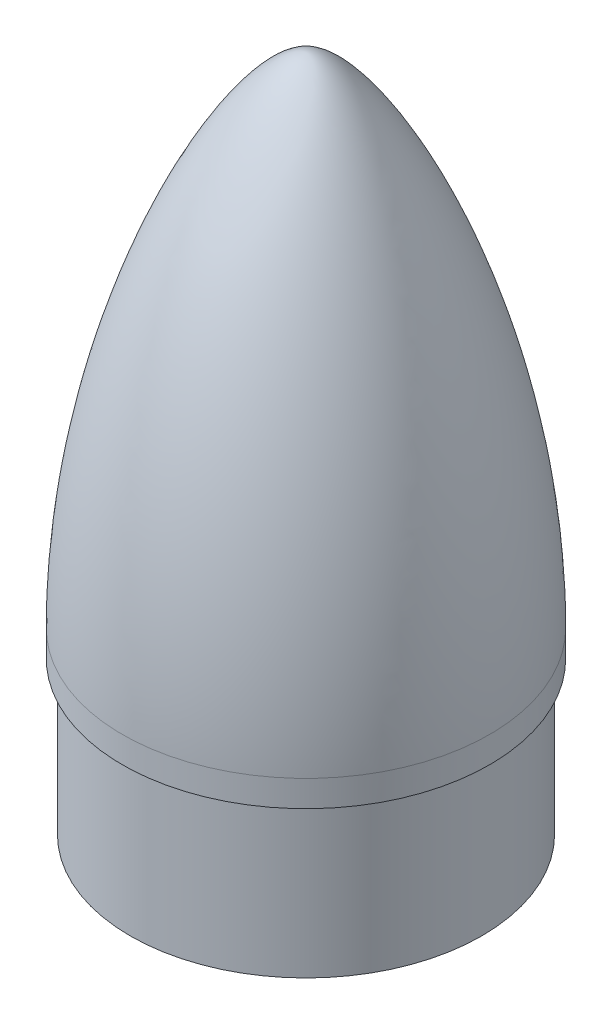
ISO-10303-21;
HEADER;
FILE_DESCRIPTION(('STEP AP214'),'2;1');
FILE_NAME('part.step','',(''),(''),'','','');
FILE_SCHEMA(('AUTOMOTIVE_DESIGN { 1 0 10303 214 1 1 1 1 }'));
ENDSEC;
DATA;
#1=APPLICATION_CONTEXT('core data for automotive mechanical design processes');
#2=APPLICATION_PROTOCOL_DEFINITION('international standard','automotive_design',2000,#1);
#3=PRODUCT_CONTEXT('',#1,'mechanical');
#4=PRODUCT('Part','Part','',(#3));
#5=PRODUCT_RELATED_PRODUCT_CATEGORY('part','',(#4));
#6=PRODUCT_DEFINITION_FORMATION('','',#4);
#7=PRODUCT_DEFINITION_CONTEXT('part definition',#1,'design');
#8=PRODUCT_DEFINITION('design','',#6,#7);
#9=PRODUCT_DEFINITION_SHAPE('','',#8);
#10=(LENGTH_UNIT() NAMED_UNIT(*) SI_UNIT(.MILLI.,.METRE.));
#11=(NAMED_UNIT(*) PLANE_ANGLE_UNIT() SI_UNIT($,.RADIAN.));
#12=(NAMED_UNIT(*) SI_UNIT($,.STERADIAN.) SOLID_ANGLE_UNIT());
#13=UNCERTAINTY_MEASURE_WITH_UNIT(LENGTH_MEASURE(1.E-05),#10,'distance_accuracy_value','');
#14=(GEOMETRIC_REPRESENTATION_CONTEXT(3) GLOBAL_UNCERTAINTY_ASSIGNED_CONTEXT((#13)) GLOBAL_UNIT_ASSIGNED_CONTEXT((#10,
#11,#12)) REPRESENTATION_CONTEXT('',''));
#15=CARTESIAN_POINT('',(0.,0.,0.));
#16=DIRECTION('',(0.,0.,1.));
#17=DIRECTION('',(1.,0.,0.));
#18=AXIS2_PLACEMENT_3D('',#15,#16,#17);
#19=CARTESIAN_POINT('',(0.,2.,0.));
#20=DIRECTION('',(0.,-1.,0.));
#21=DIRECTION('',(0.,0.,-1.));
#22=AXIS2_PLACEMENT_3D('',#19,#20,#21);
#23=PLANE('',#22);
#24=DIRECTION('',(1.,0.,0.));
#25=VECTOR('',#24,1.);
#26=CARTESIAN_POINT('',(-12.5,2.,-7.5));
#27=LINE('',#26,#25);
#28=CARTESIAN_POINT('',(-12.5,2.,-7.5));
#29=VERTEX_POINT('',#28);
#30=CARTESIAN_POINT('',(-2.5,2.,-7.5));
#31=VERTEX_POINT('',#30);
#32=EDGE_CURVE('E120',#29,#31,#27,.T.);
#33=ORIENTED_EDGE('',*,*,#32,.T.);
#34=DIRECTION('',(0.,0.,1.));
#35=VECTOR('',#34,1.);
#36=CARTESIAN_POINT('',(-2.5,2.,7.5));
#37=LINE('',#36,#35);
#38=CARTESIAN_POINT('',(-2.5,2.,7.5));
#39=VERTEX_POINT('',#38);
#40=EDGE_CURVE('E113',#31,#39,#37,.T.);
#41=ORIENTED_EDGE('',*,*,#40,.T.);
#42=DIRECTION('',(-1.,0.,0.));
#43=VECTOR('',#42,1.);
#44=CARTESIAN_POINT('',(-12.5,2.,7.5));
#45=LINE('',#44,#43);
#46=CARTESIAN_POINT('',(-12.5,2.,7.5));
#47=VERTEX_POINT('',#46);
#48=EDGE_CURVE('E124',#39,#47,#45,.T.);
#49=ORIENTED_EDGE('',*,*,#48,.T.);
#50=DIRECTION('',(0.,0.,-1.));
#51=VECTOR('',#50,1.);
#52=CARTESIAN_POINT('',(-12.5,2.,7.5));
#53=LINE('',#52,#51);
#54=EDGE_CURVE('E129',#47,#29,#53,.T.);
#55=ORIENTED_EDGE('',*,*,#54,.T.);
#56=EDGE_LOOP('',(#33,#41,#49,#55));
#57=FACE_BOUND('',#56,.T.);
#58=DIRECTION('',(1.,0.,0.));
#59=VECTOR('',#58,1.);
#60=CARTESIAN_POINT('',(12.5,2.,-7.5));
#61=LINE('',#60,#59);
#62=CARTESIAN_POINT('',(2.5,2.,-7.5));
#63=VERTEX_POINT('',#62);
#64=CARTESIAN_POINT('',(12.5,2.,-7.5));
#65=VERTEX_POINT('',#64);
#66=EDGE_CURVE('E176',#63,#65,#61,.T.);
#67=ORIENTED_EDGE('',*,*,#66,.T.);
#68=DIRECTION('',(0.,0.,1.));
#69=VECTOR('',#68,1.);
#70=CARTESIAN_POINT('',(12.5,2.,7.5));
#71=LINE('',#70,#69);
#72=CARTESIAN_POINT('',(12.5,2.,7.5));
#73=VERTEX_POINT('',#72);
#74=EDGE_CURVE('E163',#65,#73,#71,.T.);
#75=ORIENTED_EDGE('',*,*,#74,.T.);
#76=DIRECTION('',(-1.,0.,0.));
#77=VECTOR('',#76,1.);
#78=CARTESIAN_POINT('',(12.5,2.,7.5));
#79=LINE('',#78,#77);
#80=CARTESIAN_POINT('',(2.5,2.,7.5));
#81=VERTEX_POINT('',#80);
#82=EDGE_CURVE('E167',#73,#81,#79,.T.);
#83=ORIENTED_EDGE('',*,*,#82,.T.);
#84=DIRECTION('',(0.,0.,-1.));
#85=VECTOR('',#84,1.);
#86=CARTESIAN_POINT('',(2.5,2.,7.5));
#87=LINE('',#86,#85);
#88=EDGE_CURVE('E172',#81,#63,#87,.T.);
#89=ORIENTED_EDGE('',*,*,#88,.T.);
#90=EDGE_LOOP('',(#67,#75,#83,#89));
#91=FACE_BOUND('',#90,.T.);
#92=CARTESIAN_POINT('',(0.,2.,0.));
#93=DIRECTION('',(0.,-1.,0.));
#94=DIRECTION('',(0.,0.,-1.));
#95=AXIS2_PLACEMENT_3D('',#92,#93,#94);
#96=CIRCLE('',#95,32.5);
#97=CARTESIAN_POINT('',(0.,2.,-32.5));
#98=VERTEX_POINT('',#97);
#99=EDGE_CURVE('E11',#98,#98,#96,.F.);
#100=ORIENTED_EDGE('',*,*,#99,.T.);
#101=EDGE_LOOP('',(#100));
#102=FACE_BOUND('',#101,.T.);
#103=ADVANCED_FACE('F38',(#57,#91,#102),#23,.F.);
#104=CARTESIAN_POINT('',(-33.9984834510939,34.6786506050008,0.));
#105=CARTESIAN_POINT('',(-33.9915812633825,36.2240925123497,0.));
#106=CARTESIAN_POINT('',(-33.9303574604645,39.3230386382384,0.));
#107=CARTESIAN_POINT('',(-33.6280118613406,45.4497178576455,0.));
#108=CARTESIAN_POINT('',(-32.930147657717,52.99993654685,0.));
#109=CARTESIAN_POINT('',(-31.6372371268909,61.8163569039507,0.));
#110=CARTESIAN_POINT('',(-29.3814287660913,73.1747948283669,0.));
#111=CARTESIAN_POINT('',(-25.7059364143125,86.4831247892104,0.));
#112=CARTESIAN_POINT('',(-20.3817825086819,100.569855923973,0.));
#113=CARTESIAN_POINT('',(-15.5662748543772,110.353659681135,0.));
#114=CARTESIAN_POINT('',(-11.7215629167951,116.772432580982,0.));
#115=CARTESIAN_POINT('',(-8.90332370246968,120.821784374969,0.));
#116=CARTESIAN_POINT('',(-6.21625164359502,124.04410690482,0.));
#117=CARTESIAN_POINT('',(-4.14908494440189,125.985259834318,0.));
#118=CARTESIAN_POINT('',(-2.65272498093548,127.05946520372,0.));
#119=CARTESIAN_POINT('',(-1.62806019340739,127.620483155812,0.));
#120=CARTESIAN_POINT('',(-0.879863893824048,127.885142379995,0.));
#121=CARTESIAN_POINT('',(-0.348657385476862,127.984548617707,0.));
#122=CARTESIAN_POINT('',(-0.119526866006632,128.,0.));
#123=CARTESIAN_POINT('',(0.,128.,0.));
#124=B_SPLINE_CURVE_WITH_KNOTS('',3,(#104,#105,#106,#107,#108,#109,#110,#111,#112,#113,#114,
#115,#116,#117,#118,#119,#120,#121,#122,#123),.UNSPECIFIED.,.F.,.F.,(4,1,1,1,1,1,1,1,1,1,1,1,1,
1,1,1,1,4),(0.00453547611212338,0.0356437424836195,0.0667520088551157,0.128968541598108,
0.1911850743411,0.253401607084093,0.377834672570077,0.502267738056062,0.626700803542046,
0.688917336285039,0.751133869028031,0.813350401771023,0.875566934514015,0.906675200885512,
0.937783467257008,0.968891733628504,0.984445866814252,1.),.UNSPECIFIED.);
#125=CARTESIAN_POINT('',(0.,0.,0.));
#126=DIRECTION('',(0.,-1.,0.));
#127=AXIS1_PLACEMENT('',#125,#126);
#128=SURFACE_OF_REVOLUTION('',#124,#127);
#129=CARTESIAN_POINT('',(0.,128.,0.));
#130=VERTEX_POINT('',#129);
#131=VERTEX_LOOP('',#130);
#132=FACE_BOUND('',#131,.T.);
#133=CARTESIAN_POINT('',(0.,34.6786506050008,0.));
#134=DIRECTION('',(0.,-1.,0.));
#135=DIRECTION('',(0.,0.,-1.));
#136=AXIS2_PLACEMENT_3D('',#133,#134,#135);
#137=CIRCLE('',#136,33.9984834510939);
#138=CARTESIAN_POINT('',(0.,34.6786506050008,-33.9984834510939));
#139=VERTEX_POINT('',#138);
#140=EDGE_CURVE('E157',#139,#139,#137,.T.);
#141=ORIENTED_EDGE('',*,*,#140,.T.);
#142=EDGE_LOOP('',(#141));
#143=FACE_BOUND('',#142,.T.);
#144=ADVANCED_FACE('F40',(#132,#143),#128,.T.);
#145=CARTESIAN_POINT('',(0.,33.6786517549617,0.));
#146=DIRECTION('',(0.,-1.,0.));
#147=DIRECTION('',(0.,0.,-1.));
#148=AXIS2_PLACEMENT_3D('',#145,#146,#147);
#149=CONICAL_SURFACE('',#148,34.,0.00151654948737685);
#150=ORIENTED_EDGE('',*,*,#140,.F.);
#151=EDGE_LOOP('',(#150));
#152=FACE_BOUND('',#151,.T.);
#153=CARTESIAN_POINT('',(0.,33.6786517549617,0.));
#154=DIRECTION('',(0.,-1.,0.));
#155=DIRECTION('',(0.,0.,-1.));
#156=AXIS2_PLACEMENT_3D('',#153,#154,#155);
#157=CIRCLE('',#156,34.);
#158=CARTESIAN_POINT('',(0.,33.6786517549617,-34.));
#159=VERTEX_POINT('',#158);
#160=EDGE_CURVE('E320',#159,#159,#157,.T.);
#161=ORIENTED_EDGE('',*,*,#160,.T.);
#162=EDGE_LOOP('',(#161));
#163=FACE_BOUND('',#162,.T.);
#164=ADVANCED_FACE('F250',(#152,#163),#149,.F.);
#165=CARTESIAN_POINT('',(0.,0.,0.));
#166=DIRECTION('',(0.,-1.,0.));
#167=DIRECTION('',(0.,0.,-1.));
#168=AXIS2_PLACEMENT_3D('',#165,#166,#167);
#169=CYLINDRICAL_SURFACE('',#168,34.);
#170=ORIENTED_EDGE('',*,*,#160,.F.);
#171=EDGE_LOOP('',(#170));
#172=FACE_BOUND('',#171,.T.);
#173=CARTESIAN_POINT('',(0.,30.,0.));
#174=DIRECTION('',(0.,-1.,0.));
#175=DIRECTION('',(0.,0.,-1.));
#176=AXIS2_PLACEMENT_3D('',#173,#174,#175);
#177=CIRCLE('',#176,34.);
#178=CARTESIAN_POINT('',(0.,30.,-34.));
#179=VERTEX_POINT('',#178);
#180=EDGE_CURVE('E303',#179,#179,#177,.T.);
#181=ORIENTED_EDGE('',*,*,#180,.T.);
#182=EDGE_LOOP('',(#181));
#183=FACE_BOUND('',#182,.T.);
#184=ADVANCED_FACE('F246',(#172,#183),#169,.F.);
#185=CARTESIAN_POINT('',(-32.5,30.,0.));
#186=DIRECTION('',(0.,-1.,0.));
#187=DIRECTION('',(0.,0.,-1.));
#188=AXIS2_PLACEMENT_3D('',#185,#186,#187);
#189=PLANE('',#188);
#190=ORIENTED_EDGE('',*,*,#180,.F.);
#191=EDGE_LOOP('',(#190));
#192=FACE_BOUND('',#191,.T.);
#193=CARTESIAN_POINT('',(0.,30.,0.));
#194=DIRECTION('',(0.,-1.,0.));
#195=DIRECTION('',(0.,0.,-1.));
#196=AXIS2_PLACEMENT_3D('',#193,#194,#195);
#197=CIRCLE('',#196,32.5);
#198=CARTESIAN_POINT('',(0.,30.,-32.5));
#199=VERTEX_POINT('',#198);
#200=EDGE_CURVE('E295',#199,#199,#197,.T.);
#201=ORIENTED_EDGE('',*,*,#200,.T.);
#202=EDGE_LOOP('',(#201));
#203=FACE_BOUND('',#202,.T.);
#204=ADVANCED_FACE('F242',(#192,#203),#189,.F.);
#205=CARTESIAN_POINT('',(0.,0.,0.));
#206=DIRECTION('',(0.,-1.,0.));
#207=DIRECTION('',(0.,0.,-1.));
#208=AXIS2_PLACEMENT_3D('',#205,#206,#207);
#209=CYLINDRICAL_SURFACE('',#208,32.5);
#210=ORIENTED_EDGE('',*,*,#200,.F.);
#211=EDGE_LOOP('',(#210));
#212=FACE_BOUND('',#211,.T.);
#213=ORIENTED_EDGE('',*,*,#99,.F.);
#214=EDGE_LOOP('',(#213));
#215=FACE_BOUND('',#214,.T.);
#216=ADVANCED_FACE('F238',(#212,#215),#209,.F.);
#217=CARTESIAN_POINT('',(12.5,2.,7.5));
#218=DIRECTION('',(1.,0.,0.));
#219=DIRECTION('',(0.,0.,-1.));
#220=AXIS2_PLACEMENT_3D('',#217,#218,#219);
#221=PLANE('',#220);
#222=DIRECTION('',(0.,0.,1.));
#223=VECTOR('',#222,1.);
#224=CARTESIAN_POINT('',(12.5,0.,7.5));
#225=LINE('',#224,#223);
#226=CARTESIAN_POINT('',(12.5,0.,-7.5));
#227=VERTEX_POINT('',#226);
#228=CARTESIAN_POINT('',(12.5,0.,7.5));
#229=VERTEX_POINT('',#228);
#230=EDGE_CURVE('E63',#227,#229,#225,.T.);
#231=ORIENTED_EDGE('',*,*,#230,.T.);
#232=DIRECTION('',(0.,-1.,0.));
#233=VECTOR('',#232,1.);
#234=CARTESIAN_POINT('',(12.5,2.,7.5));
#235=LINE('',#234,#233);
#236=EDGE_CURVE('E180',#73,#229,#235,.T.);
#237=ORIENTED_EDGE('',*,*,#236,.F.);
#238=ORIENTED_EDGE('',*,*,#74,.F.);
#239=DIRECTION('',(0.,-1.,0.));
#240=VECTOR('',#239,1.);
#241=CARTESIAN_POINT('',(12.5,2.,-7.5));
#242=LINE('',#241,#240);
#243=EDGE_CURVE('E148',#65,#227,#242,.T.);
#244=ORIENTED_EDGE('',*,*,#243,.T.);
#245=EDGE_LOOP('',(#231,#237,#238,#244));
#246=FACE_BOUND('',#245,.T.);
#247=ADVANCED_FACE('F241',(#246),#221,.F.);
#248=CARTESIAN_POINT('',(12.5,2.,-7.5));
#249=DIRECTION('',(0.,0.,-1.));
#250=DIRECTION('',(-1.,0.,0.));
#251=AXIS2_PLACEMENT_3D('',#248,#249,#250);
#252=PLANE('',#251);
#253=DIRECTION('',(1.,0.,0.));
#254=VECTOR('',#253,1.);
#255=CARTESIAN_POINT('',(12.5,0.,-7.5));
#256=LINE('',#255,#254);
#257=CARTESIAN_POINT('',(2.5,0.,-7.5));
#258=VERTEX_POINT('',#257);
#259=EDGE_CURVE('E168',#258,#227,#256,.T.);
#260=ORIENTED_EDGE('',*,*,#259,.T.);
#261=ORIENTED_EDGE('',*,*,#243,.F.);
#262=ORIENTED_EDGE('',*,*,#66,.F.);
#263=DIRECTION('',(0.,-1.,0.));
#264=VECTOR('',#263,1.);
#265=CARTESIAN_POINT('',(2.5,2.,-7.5));
#266=LINE('',#265,#264);
#267=EDGE_CURVE('E196',#63,#258,#266,.T.);
#268=ORIENTED_EDGE('',*,*,#267,.T.);
#269=EDGE_LOOP('',(#260,#261,#262,#268));
#270=FACE_BOUND('',#269,.T.);
#271=ADVANCED_FACE('F259',(#270),#252,.F.);
#272=CARTESIAN_POINT('',(2.5,2.,7.5));
#273=DIRECTION('',(-1.,0.,0.));
#274=DIRECTION('',(0.,0.,1.));
#275=AXIS2_PLACEMENT_3D('',#272,#273,#274);
#276=PLANE('',#275);
#277=DIRECTION('',(0.,0.,-1.));
#278=VECTOR('',#277,1.);
#279=CARTESIAN_POINT('',(2.5,0.,7.5));
#280=LINE('',#279,#278);
#281=CARTESIAN_POINT('',(2.5,0.,7.5));
#282=VERTEX_POINT('',#281);
#283=EDGE_CURVE('E187',#282,#258,#280,.T.);
#284=ORIENTED_EDGE('',*,*,#283,.T.);
#285=ORIENTED_EDGE('',*,*,#267,.F.);
#286=ORIENTED_EDGE('',*,*,#88,.F.);
#287=DIRECTION('',(0.,-1.,0.));
#288=VECTOR('',#287,1.);
#289=CARTESIAN_POINT('',(2.5,2.,7.5));
#290=LINE('',#289,#288);
#291=EDGE_CURVE('E199',#81,#282,#290,.T.);
#292=ORIENTED_EDGE('',*,*,#291,.T.);
#293=EDGE_LOOP('',(#284,#285,#286,#292));
#294=FACE_BOUND('',#293,.T.);
#295=ADVANCED_FACE('F263',(#294),#276,.F.);
#296=CARTESIAN_POINT('',(12.5,2.,7.5));
#297=DIRECTION('',(0.,0.,1.));
#298=DIRECTION('',(1.,0.,0.));
#299=AXIS2_PLACEMENT_3D('',#296,#297,#298);
#300=PLANE('',#299);
#301=DIRECTION('',(-1.,0.,0.));
#302=VECTOR('',#301,1.);
#303=CARTESIAN_POINT('',(12.5,0.,7.5));
#304=LINE('',#303,#302);
#305=EDGE_CURVE('E183',#229,#282,#304,.T.);
#306=ORIENTED_EDGE('',*,*,#305,.T.);
#307=ORIENTED_EDGE('',*,*,#291,.F.);
#308=ORIENTED_EDGE('',*,*,#82,.F.);
#309=ORIENTED_EDGE('',*,*,#236,.T.);
#310=EDGE_LOOP('',(#306,#307,#308,#309));
#311=FACE_BOUND('',#310,.T.);
#312=ADVANCED_FACE('F260',(#311),#300,.F.);
#313=CARTESIAN_POINT('',(-2.5,2.,7.5));
#314=DIRECTION('',(1.,0.,0.));
#315=DIRECTION('',(0.,0.,-1.));
#316=AXIS2_PLACEMENT_3D('',#313,#314,#315);
#317=PLANE('',#316);
#318=DIRECTION('',(0.,0.,1.));
#319=VECTOR('',#318,1.);
#320=CARTESIAN_POINT('',(-2.5,0.,7.5));
#321=LINE('',#320,#319);
#322=CARTESIAN_POINT('',(-2.5,0.,-7.5));
#323=VERTEX_POINT('',#322);
#324=CARTESIAN_POINT('',(-2.5,0.,7.5));
#325=VERTEX_POINT('',#324);
#326=EDGE_CURVE('E55',#323,#325,#321,.T.);
#327=ORIENTED_EDGE('',*,*,#326,.T.);
#328=DIRECTION('',(0.,-1.,0.));
#329=VECTOR('',#328,1.);
#330=CARTESIAN_POINT('',(-2.5,2.,7.5));
#331=LINE('',#330,#329);
#332=EDGE_CURVE('E109',#39,#325,#331,.T.);
#333=ORIENTED_EDGE('',*,*,#332,.F.);
#334=ORIENTED_EDGE('',*,*,#40,.F.);
#335=DIRECTION('',(0.,-1.,0.));
#336=VECTOR('',#335,1.);
#337=CARTESIAN_POINT('',(-2.5,2.,-7.5));
#338=LINE('',#337,#336);
#339=EDGE_CURVE('E154',#31,#323,#338,.T.);
#340=ORIENTED_EDGE('',*,*,#339,.T.);
#341=EDGE_LOOP('',(#327,#333,#334,#340));
#342=FACE_BOUND('',#341,.T.);
#343=ADVANCED_FACE('F111',(#342),#317,.F.);
#344=CARTESIAN_POINT('',(-12.5,2.,-7.5));
#345=DIRECTION('',(0.,0.,-1.));
#346=DIRECTION('',(-1.,0.,0.));
#347=AXIS2_PLACEMENT_3D('',#344,#345,#346);
#348=PLANE('',#347);
#349=DIRECTION('',(1.,0.,0.));
#350=VECTOR('',#349,1.);
#351=CARTESIAN_POINT('',(-12.5,0.,-7.5));
#352=LINE('',#351,#350);
#353=CARTESIAN_POINT('',(-12.5,0.,-7.5));
#354=VERTEX_POINT('',#353);
#355=EDGE_CURVE('E134',#354,#323,#352,.T.);
#356=ORIENTED_EDGE('',*,*,#355,.T.);
#357=ORIENTED_EDGE('',*,*,#339,.F.);
#358=ORIENTED_EDGE('',*,*,#32,.F.);
#359=DIRECTION('',(0.,-1.,0.));
#360=VECTOR('',#359,1.);
#361=CARTESIAN_POINT('',(-12.5,2.,-7.5));
#362=LINE('',#361,#360);
#363=EDGE_CURVE('E158',#29,#354,#362,.T.);
#364=ORIENTED_EDGE('',*,*,#363,.T.);
#365=EDGE_LOOP('',(#356,#357,#358,#364));
#366=FACE_BOUND('',#365,.T.);
#367=ADVANCED_FACE('F273',(#366),#348,.F.);
#368=CARTESIAN_POINT('',(-12.5,2.,7.5));
#369=DIRECTION('',(-1.,0.,0.));
#370=DIRECTION('',(0.,0.,1.));
#371=AXIS2_PLACEMENT_3D('',#368,#369,#370);
#372=PLANE('',#371);
#373=DIRECTION('',(0.,0.,-1.));
#374=VECTOR('',#373,1.);
#375=CARTESIAN_POINT('',(-12.5,0.,7.5));
#376=LINE('',#375,#374);
#377=CARTESIAN_POINT('',(-12.5,0.,7.5));
#378=VERTEX_POINT('',#377);
#379=EDGE_CURVE('E138',#378,#354,#376,.T.);
#380=ORIENTED_EDGE('',*,*,#379,.T.);
#381=ORIENTED_EDGE('',*,*,#363,.F.);
#382=ORIENTED_EDGE('',*,*,#54,.F.);
#383=DIRECTION('',(0.,-1.,0.));
#384=VECTOR('',#383,1.);
#385=CARTESIAN_POINT('',(-12.5,2.,7.5));
#386=LINE('',#385,#384);
#387=EDGE_CURVE('E119',#47,#378,#386,.T.);
#388=ORIENTED_EDGE('',*,*,#387,.T.);
#389=EDGE_LOOP('',(#380,#381,#382,#388));
#390=FACE_BOUND('',#389,.T.);
#391=ADVANCED_FACE('F276',(#390),#372,.F.);
#392=CARTESIAN_POINT('',(-12.5,2.,7.5));
#393=DIRECTION('',(0.,0.,1.));
#394=DIRECTION('',(1.,0.,0.));
#395=AXIS2_PLACEMENT_3D('',#392,#393,#394);
#396=PLANE('',#395);
#397=DIRECTION('',(-1.,0.,0.));
#398=VECTOR('',#397,1.);
#399=CARTESIAN_POINT('',(-12.5,0.,7.5));
#400=LINE('',#399,#398);
#401=EDGE_CURVE('E147',#325,#378,#400,.T.);
#402=ORIENTED_EDGE('',*,*,#401,.T.);
#403=ORIENTED_EDGE('',*,*,#387,.F.);
#404=ORIENTED_EDGE('',*,*,#48,.F.);
#405=ORIENTED_EDGE('',*,*,#332,.T.);
#406=EDGE_LOOP('',(#402,#403,#404,#405));
#407=FACE_BOUND('',#406,.T.);
#408=ADVANCED_FACE('F125',(#407),#396,.F.);
#409=CARTESIAN_POINT('',(-35.,34.,0.));
#410=CARTESIAN_POINT('',(-35.,84.2304773408692,0.));
#411=CARTESIAN_POINT('',(-10.2040775450126,129.,0.));
#412=CARTESIAN_POINT('',(0.,129.,0.));
#413=B_SPLINE_CURVE_WITH_KNOTS('',3,(#409,#410,#411,#412),.UNSPECIFIED.,.F.,.F.,(4,4),(0.,1.),.UNSPECIFIED.);
#414=CARTESIAN_POINT('',(0.,0.,0.));
#415=DIRECTION('',(0.,-1.,0.));
#416=AXIS1_PLACEMENT('',#414,#415);
#417=SURFACE_OF_REVOLUTION('',#413,#416);
#418=CARTESIAN_POINT('',(0.,129.,0.));
#419=VERTEX_POINT('',#418);
#420=VERTEX_LOOP('',#419);
#421=FACE_BOUND('',#420,.T.);
#422=CARTESIAN_POINT('',(0.,34.,0.));
#423=DIRECTION('',(0.,-1.,0.));
#424=DIRECTION('',(0.,0.,-1.));
#425=AXIS2_PLACEMENT_3D('',#422,#423,#424);
#426=CIRCLE('',#425,35.);
#427=CARTESIAN_POINT('',(0.,34.,-35.));
#428=VERTEX_POINT('',#427);
#429=EDGE_CURVE('E48',#428,#428,#426,.T.);
#430=ORIENTED_EDGE('',*,*,#429,.F.);
#431=EDGE_LOOP('',(#430));
#432=FACE_BOUND('',#431,.T.);
#433=ADVANCED_FACE('F218',(#421,#432),#417,.F.);
#434=CARTESIAN_POINT('',(0.,0.,0.));
#435=DIRECTION('',(0.,-1.,0.));
#436=DIRECTION('',(0.,0.,-1.));
#437=AXIS2_PLACEMENT_3D('',#434,#435,#436);
#438=CYLINDRICAL_SURFACE('',#437,35.);
#439=ORIENTED_EDGE('',*,*,#429,.T.);
#440=EDGE_LOOP('',(#439));
#441=FACE_BOUND('',#440,.T.);
#442=CARTESIAN_POINT('',(0.,29.,0.));
#443=DIRECTION('',(0.,-1.,0.));
#444=DIRECTION('',(0.,0.,-1.));
#445=AXIS2_PLACEMENT_3D('',#442,#443,#444);
#446=CIRCLE('',#445,35.);
#447=CARTESIAN_POINT('',(0.,29.,-35.));
#448=VERTEX_POINT('',#447);
#449=EDGE_CURVE('E300',#448,#448,#446,.T.);
#450=ORIENTED_EDGE('',*,*,#449,.F.);
#451=EDGE_LOOP('',(#450));
#452=FACE_BOUND('',#451,.T.);
#453=ADVANCED_FACE('F221',(#441,#452),#438,.T.);
#454=CARTESIAN_POINT('',(-33.5,29.,0.));
#455=DIRECTION('',(0.,-1.,0.));
#456=DIRECTION('',(0.,0.,-1.));
#457=AXIS2_PLACEMENT_3D('',#454,#455,#456);
#458=PLANE('',#457);
#459=ORIENTED_EDGE('',*,*,#449,.T.);
#460=EDGE_LOOP('',(#459));
#461=FACE_BOUND('',#460,.T.);
#462=CARTESIAN_POINT('',(0.,29.,0.));
#463=DIRECTION('',(0.,-1.,0.));
#464=DIRECTION('',(0.,0.,-1.));
#465=AXIS2_PLACEMENT_3D('',#462,#463,#464);
#466=CIRCLE('',#465,33.5);
#467=CARTESIAN_POINT('',(0.,29.,-33.5));
#468=VERTEX_POINT('',#467);
#469=EDGE_CURVE('E294',#468,#468,#466,.T.);
#470=ORIENTED_EDGE('',*,*,#469,.F.);
#471=EDGE_LOOP('',(#470));
#472=FACE_BOUND('',#471,.T.);
#473=ADVANCED_FACE('F225',(#461,#472),#458,.T.);
#474=CARTESIAN_POINT('',(0.,0.,0.));
#475=DIRECTION('',(0.,-1.,0.));
#476=DIRECTION('',(0.,0.,-1.));
#477=AXIS2_PLACEMENT_3D('',#474,#475,#476);
#478=CYLINDRICAL_SURFACE('',#477,33.5);
#479=CARTESIAN_POINT('',(0.,0.,0.));
#480=DIRECTION('',(0.,-1.,0.));
#481=DIRECTION('',(0.,0.,-1.));
#482=AXIS2_PLACEMENT_3D('',#479,#480,#481);
#483=CIRCLE('',#482,33.5);
#484=CARTESIAN_POINT('',(0.,0.,-33.5));
#485=VERTEX_POINT('',#484);
#486=EDGE_CURVE('E292',#485,#485,#483,.T.);
#487=ORIENTED_EDGE('',*,*,#486,.F.);
#488=EDGE_LOOP('',(#487));
#489=FACE_BOUND('',#488,.T.);
#490=ORIENTED_EDGE('',*,*,#469,.T.);
#491=EDGE_LOOP('',(#490));
#492=FACE_BOUND('',#491,.T.);
#493=ADVANCED_FACE('F229',(#489,#492),#478,.T.);
#494=CARTESIAN_POINT('',(-33.5,0.,0.));
#495=DIRECTION('',(0.,1.,0.));
#496=DIRECTION('',(0.,0.,1.));
#497=AXIS2_PLACEMENT_3D('',#494,#495,#496);
#498=PLANE('',#497);
#499=ORIENTED_EDGE('',*,*,#401,.F.);
#500=ORIENTED_EDGE('',*,*,#326,.F.);
#501=ORIENTED_EDGE('',*,*,#355,.F.);
#502=ORIENTED_EDGE('',*,*,#379,.F.);
#503=EDGE_LOOP('',(#499,#500,#501,#502));
#504=FACE_BOUND('',#503,.T.);
#505=ORIENTED_EDGE('',*,*,#305,.F.);
#506=ORIENTED_EDGE('',*,*,#230,.F.);
#507=ORIENTED_EDGE('',*,*,#259,.F.);
#508=ORIENTED_EDGE('',*,*,#283,.F.);
#509=EDGE_LOOP('',(#505,#506,#507,#508));
#510=FACE_BOUND('',#509,.T.);
#511=ORIENTED_EDGE('',*,*,#486,.T.);
#512=EDGE_LOOP('',(#511));
#513=FACE_BOUND('',#512,.T.);
#514=ADVANCED_FACE('F233',(#504,#510,#513),#498,.F.);
#515=CLOSED_SHELL('',(#103,#144,#164,#184,#204,#216,#247,#271,#295,#312,#343,#367,#391,#408,
#433,#453,#473,#493,#514));
#516=MANIFOLD_SOLID_BREP('B2',#515);
#517=ADVANCED_BREP_SHAPE_REPRESENTATION('',(#18,#516),#14);
#518=SHAPE_DEFINITION_REPRESENTATION(#9,#517);
ENDSEC;
END-ISO-10303-21;
